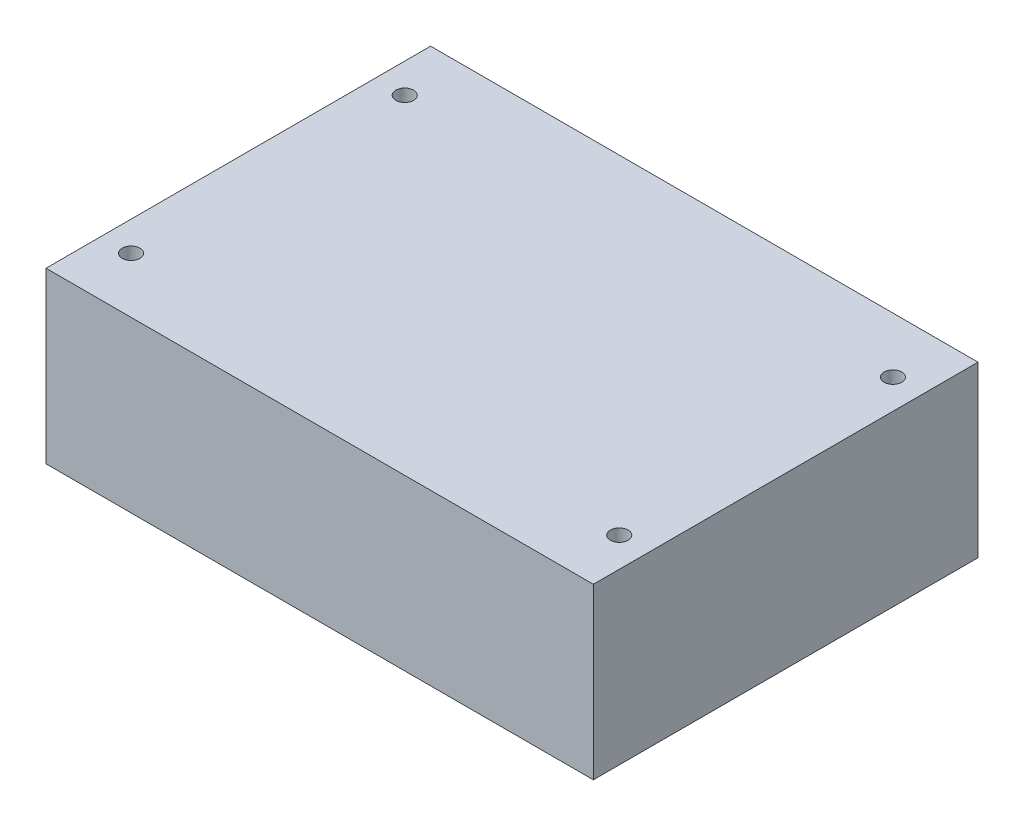
ISO-10303-21;
HEADER;
FILE_DESCRIPTION(('STEP AP214'),'2;1');
FILE_NAME('part.step','',(''),(''),'','','');
FILE_SCHEMA(('AUTOMOTIVE_DESIGN { 1 0 10303 214 1 1 1 1 }'));
ENDSEC;
DATA;
#1=APPLICATION_CONTEXT('core data for automotive mechanical design processes');
#2=APPLICATION_PROTOCOL_DEFINITION('international standard','automotive_design',2000,#1);
#3=PRODUCT_CONTEXT('',#1,'mechanical');
#4=PRODUCT('Part','Part','',(#3));
#5=PRODUCT_RELATED_PRODUCT_CATEGORY('part','',(#4));
#6=PRODUCT_DEFINITION_FORMATION('','',#4);
#7=PRODUCT_DEFINITION_CONTEXT('part definition',#1,'design');
#8=PRODUCT_DEFINITION('design','',#6,#7);
#9=PRODUCT_DEFINITION_SHAPE('','',#8);
#10=(LENGTH_UNIT() NAMED_UNIT(*) SI_UNIT(.MILLI.,.METRE.));
#11=(NAMED_UNIT(*) PLANE_ANGLE_UNIT() SI_UNIT($,.RADIAN.));
#12=(NAMED_UNIT(*) SI_UNIT($,.STERADIAN.) SOLID_ANGLE_UNIT());
#13=UNCERTAINTY_MEASURE_WITH_UNIT(LENGTH_MEASURE(1.E-05),#10,'distance_accuracy_value','');
#14=(GEOMETRIC_REPRESENTATION_CONTEXT(3) GLOBAL_UNCERTAINTY_ASSIGNED_CONTEXT((#13)) GLOBAL_UNIT_ASSIGNED_CONTEXT((#10,
#11,#12)) REPRESENTATION_CONTEXT('',''));
#15=CARTESIAN_POINT('',(0.,0.,0.));
#16=DIRECTION('',(0.,0.,1.));
#17=DIRECTION('',(1.,0.,0.));
#18=AXIS2_PLACEMENT_3D('',#15,#16,#17);
#19=CARTESIAN_POINT('',(0.,33.9,-52.));
#20=DIRECTION('',(0.,0.,-1.));
#21=DIRECTION('',(-1.,0.,0.));
#22=AXIS2_PLACEMENT_3D('',#19,#20,#21);
#23=PLANE('',#22);
#24=DIRECTION('',(1.,0.,0.));
#25=VECTOR('',#24,1.);
#26=CARTESIAN_POINT('',(0.,11.,-52.));
#27=LINE('',#26,#25);
#28=CARTESIAN_POINT('',(0.,11.,-52.));
#29=VERTEX_POINT('',#28);
#30=CARTESIAN_POINT('',(74.,11.,-52.));
#31=VERTEX_POINT('',#30);
#32=EDGE_CURVE('E123',#29,#31,#27,.T.);
#33=ORIENTED_EDGE('',*,*,#32,.F.);
#34=DIRECTION('',(0.,-1.,0.));
#35=VECTOR('',#34,1.);
#36=CARTESIAN_POINT('',(0.,33.9,-52.));
#37=LINE('',#36,#35);
#38=CARTESIAN_POINT('',(0.,33.9,-52.));
#39=VERTEX_POINT('',#38);
#40=EDGE_CURVE('E11',#39,#29,#37,.T.);
#41=ORIENTED_EDGE('',*,*,#40,.F.);
#42=DIRECTION('',(1.,0.,0.));
#43=VECTOR('',#42,1.);
#44=CARTESIAN_POINT('',(0.,33.9,-52.));
#45=LINE('',#44,#43);
#46=CARTESIAN_POINT('',(74.,33.9,-52.));
#47=VERTEX_POINT('',#46);
#48=EDGE_CURVE('E124',#39,#47,#45,.T.);
#49=ORIENTED_EDGE('',*,*,#48,.T.);
#50=DIRECTION('',(0.,-1.,0.));
#51=VECTOR('',#50,1.);
#52=CARTESIAN_POINT('',(74.,33.9,-52.));
#53=LINE('',#52,#51);
#54=EDGE_CURVE('E36',#47,#31,#53,.T.);
#55=ORIENTED_EDGE('',*,*,#54,.T.);
#56=EDGE_LOOP('',(#33,#41,#49,#55));
#57=FACE_BOUND('',#56,.T.);
#58=ADVANCED_FACE('F33',(#57),#23,.T.);
#59=CARTESIAN_POINT('',(0.,33.9,0.));
#60=DIRECTION('',(-1.,0.,0.));
#61=DIRECTION('',(0.,0.,1.));
#62=AXIS2_PLACEMENT_3D('',#59,#60,#61);
#63=PLANE('',#62);
#64=DIRECTION('',(0.,0.,-1.));
#65=VECTOR('',#64,1.);
#66=CARTESIAN_POINT('',(0.,11.,0.));
#67=LINE('',#66,#65);
#68=CARTESIAN_POINT('',(0.,11.,0.));
#69=VERTEX_POINT('',#68);
#70=EDGE_CURVE('E126',#69,#29,#67,.T.);
#71=ORIENTED_EDGE('',*,*,#70,.F.);
#72=DIRECTION('',(0.,-1.,0.));
#73=VECTOR('',#72,1.);
#74=CARTESIAN_POINT('',(0.,33.9,0.));
#75=LINE('',#74,#73);
#76=CARTESIAN_POINT('',(0.,33.9,0.));
#77=VERTEX_POINT('',#76);
#78=EDGE_CURVE('E42',#77,#69,#75,.T.);
#79=ORIENTED_EDGE('',*,*,#78,.F.);
#80=DIRECTION('',(0.,0.,-1.));
#81=VECTOR('',#80,1.);
#82=CARTESIAN_POINT('',(0.,33.9,0.));
#83=LINE('',#82,#81);
#84=EDGE_CURVE('E130',#77,#39,#83,.T.);
#85=ORIENTED_EDGE('',*,*,#84,.T.);
#86=ORIENTED_EDGE('',*,*,#40,.T.);
#87=EDGE_LOOP('',(#71,#79,#85,#86));
#88=FACE_BOUND('',#87,.T.);
#89=ADVANCED_FACE('F149',(#88),#63,.T.);
#90=CARTESIAN_POINT('',(0.,33.9,0.));
#91=DIRECTION('',(0.,0.,-1.));
#92=DIRECTION('',(-1.,0.,0.));
#93=AXIS2_PLACEMENT_3D('',#90,#91,#92);
#94=PLANE('',#93);
#95=DIRECTION('',(1.,0.,0.));
#96=VECTOR('',#95,1.);
#97=CARTESIAN_POINT('',(0.,11.,0.));
#98=LINE('',#97,#96);
#99=CARTESIAN_POINT('',(74.,11.,0.));
#100=VERTEX_POINT('',#99);
#101=EDGE_CURVE('E137',#69,#100,#98,.T.);
#102=ORIENTED_EDGE('',*,*,#101,.T.);
#103=DIRECTION('',(0.,-1.,0.));
#104=VECTOR('',#103,1.);
#105=CARTESIAN_POINT('',(74.,33.9,0.));
#106=LINE('',#105,#104);
#107=CARTESIAN_POINT('',(74.,33.9,0.));
#108=VERTEX_POINT('',#107);
#109=EDGE_CURVE('E141',#108,#100,#106,.T.);
#110=ORIENTED_EDGE('',*,*,#109,.F.);
#111=DIRECTION('',(1.,0.,0.));
#112=VECTOR('',#111,1.);
#113=CARTESIAN_POINT('',(0.,33.9,0.));
#114=LINE('',#113,#112);
#115=EDGE_CURVE('E128',#77,#108,#114,.T.);
#116=ORIENTED_EDGE('',*,*,#115,.F.);
#117=ORIENTED_EDGE('',*,*,#78,.T.);
#118=EDGE_LOOP('',(#102,#110,#116,#117));
#119=FACE_BOUND('',#118,.T.);
#120=ADVANCED_FACE('F151',(#119),#94,.F.);
#121=CARTESIAN_POINT('',(74.,33.9,0.));
#122=DIRECTION('',(-1.,0.,0.));
#123=DIRECTION('',(0.,0.,1.));
#124=AXIS2_PLACEMENT_3D('',#121,#122,#123);
#125=PLANE('',#124);
#126=DIRECTION('',(0.,0.,-1.));
#127=VECTOR('',#126,1.);
#128=CARTESIAN_POINT('',(74.,11.,0.));
#129=LINE('',#128,#127);
#130=EDGE_CURVE('E134',#100,#31,#129,.T.);
#131=ORIENTED_EDGE('',*,*,#130,.T.);
#132=ORIENTED_EDGE('',*,*,#54,.F.);
#133=DIRECTION('',(0.,0.,-1.));
#134=VECTOR('',#133,1.);
#135=CARTESIAN_POINT('',(74.,33.9,0.));
#136=LINE('',#135,#134);
#137=EDGE_CURVE('E76',#108,#47,#136,.T.);
#138=ORIENTED_EDGE('',*,*,#137,.F.);
#139=ORIENTED_EDGE('',*,*,#109,.T.);
#140=EDGE_LOOP('',(#131,#132,#138,#139));
#141=FACE_BOUND('',#140,.T.);
#142=ADVANCED_FACE('F146',(#141),#125,.F.);
#143=CARTESIAN_POINT('',(0.,33.9,0.));
#144=DIRECTION('',(0.,1.,0.));
#145=DIRECTION('',(0.,0.,1.));
#146=AXIS2_PLACEMENT_3D('',#143,#144,#145);
#147=PLANE('',#146);
#148=CARTESIAN_POINT('',(4.,33.9,-44.5));
#149=DIRECTION('',(0.,1.,0.));
#150=DIRECTION('',(0.,0.,1.));
#151=AXIS2_PLACEMENT_3D('',#148,#149,#150);
#152=CIRCLE('',#151,1.2);
#153=CARTESIAN_POINT('',(4.,33.9,-43.3));
#154=VERTEX_POINT('',#153);
#155=EDGE_CURVE('E101',#154,#154,#152,.T.);
#156=ORIENTED_EDGE('',*,*,#155,.F.);
#157=EDGE_LOOP('',(#156));
#158=FACE_BOUND('',#157,.T.);
#159=CARTESIAN_POINT('',(70.,33.9,-44.5));
#160=DIRECTION('',(0.,1.,0.));
#161=DIRECTION('',(0.,0.,1.));
#162=AXIS2_PLACEMENT_3D('',#159,#160,#161);
#163=CIRCLE('',#162,1.19999999999999);
#164=CARTESIAN_POINT('',(70.,33.9,-43.3));
#165=VERTEX_POINT('',#164);
#166=EDGE_CURVE('E100',#165,#165,#163,.T.);
#167=ORIENTED_EDGE('',*,*,#166,.F.);
#168=EDGE_LOOP('',(#167));
#169=FACE_BOUND('',#168,.T.);
#170=CARTESIAN_POINT('',(70.,33.9,-7.5));
#171=DIRECTION('',(0.,1.,0.));
#172=DIRECTION('',(0.,0.,1.));
#173=AXIS2_PLACEMENT_3D('',#170,#171,#172);
#174=CIRCLE('',#173,1.20000000000001);
#175=CARTESIAN_POINT('',(70.,33.9,-6.29999999999999));
#176=VERTEX_POINT('',#175);
#177=EDGE_CURVE('E111',#176,#176,#174,.T.);
#178=ORIENTED_EDGE('',*,*,#177,.F.);
#179=EDGE_LOOP('',(#178));
#180=FACE_BOUND('',#179,.T.);
#181=CARTESIAN_POINT('',(4.,33.9,-7.5));
#182=DIRECTION('',(0.,1.,0.));
#183=DIRECTION('',(0.,0.,1.));
#184=AXIS2_PLACEMENT_3D('',#181,#182,#183);
#185=CIRCLE('',#184,1.2);
#186=CARTESIAN_POINT('',(4.,33.9,-6.3));
#187=VERTEX_POINT('',#186);
#188=EDGE_CURVE('E117',#187,#187,#185,.T.);
#189=ORIENTED_EDGE('',*,*,#188,.F.);
#190=EDGE_LOOP('',(#189));
#191=FACE_BOUND('',#190,.T.);
#192=ORIENTED_EDGE('',*,*,#48,.F.);
#193=ORIENTED_EDGE('',*,*,#84,.F.);
#194=ORIENTED_EDGE('',*,*,#115,.T.);
#195=ORIENTED_EDGE('',*,*,#137,.T.);
#196=EDGE_LOOP('',(#192,#193,#194,#195));
#197=FACE_BOUND('',#196,.T.);
#198=ADVANCED_FACE('F152',(#158,#169,#180,#191,#197),#147,.T.);
#199=CARTESIAN_POINT('',(0.,11.,0.));
#200=DIRECTION('',(0.,1.,0.));
#201=DIRECTION('',(0.,0.,1.));
#202=AXIS2_PLACEMENT_3D('',#199,#200,#201);
#203=PLANE('',#202);
#204=ORIENTED_EDGE('',*,*,#32,.T.);
#205=ORIENTED_EDGE('',*,*,#130,.F.);
#206=ORIENTED_EDGE('',*,*,#101,.F.);
#207=ORIENTED_EDGE('',*,*,#70,.T.);
#208=EDGE_LOOP('',(#204,#205,#206,#207));
#209=FACE_BOUND('',#208,.T.);
#210=ADVANCED_FACE('F148',(#209),#203,.F.);
#211=CARTESIAN_POINT('',(4.,31.4,-7.5));
#212=DIRECTION('',(0.,1.,0.));
#213=DIRECTION('',(0.,0.,1.));
#214=AXIS2_PLACEMENT_3D('',#211,#212,#213);
#215=CONICAL_SURFACE('',#214,1.2,1.02974425867666);
#216=CARTESIAN_POINT('',(4.,30.6789672571669,-7.5));
#217=VERTEX_POINT('',#216);
#218=VERTEX_LOOP('',#217);
#219=FACE_BOUND('',#218,.T.);
#220=CARTESIAN_POINT('',(4.,31.4,-7.5));
#221=DIRECTION('',(0.,1.,0.));
#222=DIRECTION('',(0.,0.,1.));
#223=AXIS2_PLACEMENT_3D('',#220,#221,#222);
#224=CIRCLE('',#223,1.2);
#225=CARTESIAN_POINT('',(4.,31.4,-6.3));
#226=VERTEX_POINT('',#225);
#227=EDGE_CURVE('E120',#226,#226,#224,.T.);
#228=ORIENTED_EDGE('',*,*,#227,.T.);
#229=EDGE_LOOP('',(#228));
#230=FACE_BOUND('',#229,.T.);
#231=ADVANCED_FACE('F160',(#219,#230),#215,.F.);
#232=CARTESIAN_POINT('',(4.,33.9,-7.5));
#233=DIRECTION('',(0.,1.,0.));
#234=DIRECTION('',(0.,0.,1.));
#235=AXIS2_PLACEMENT_3D('',#232,#233,#234);
#236=CYLINDRICAL_SURFACE('',#235,1.2);
#237=ORIENTED_EDGE('',*,*,#227,.F.);
#238=EDGE_LOOP('',(#237));
#239=FACE_BOUND('',#238,.T.);
#240=ORIENTED_EDGE('',*,*,#188,.T.);
#241=EDGE_LOOP('',(#240));
#242=FACE_BOUND('',#241,.T.);
#243=ADVANCED_FACE('F199',(#239,#242),#236,.F.);
#244=CARTESIAN_POINT('',(70.,31.4,-7.5));
#245=DIRECTION('',(0.,1.,0.));
#246=DIRECTION('',(0.,0.,1.));
#247=AXIS2_PLACEMENT_3D('',#244,#245,#246);
#248=CONICAL_SURFACE('',#247,1.19999999999999,1.02974425867665);
#249=CARTESIAN_POINT('',(70.,30.6789672571669,-7.5));
#250=VERTEX_POINT('',#249);
#251=VERTEX_LOOP('',#250);
#252=FACE_BOUND('',#251,.T.);
#253=CARTESIAN_POINT('',(70.,31.4,-7.5));
#254=DIRECTION('',(0.,1.,0.));
#255=DIRECTION('',(0.,0.,1.));
#256=AXIS2_PLACEMENT_3D('',#253,#254,#255);
#257=CIRCLE('',#256,1.19999999999999);
#258=CARTESIAN_POINT('',(70.,31.4,-6.30000000000001));
#259=VERTEX_POINT('',#258);
#260=EDGE_CURVE('E114',#259,#259,#257,.T.);
#261=ORIENTED_EDGE('',*,*,#260,.T.);
#262=EDGE_LOOP('',(#261));
#263=FACE_BOUND('',#262,.T.);
#264=ADVANCED_FACE('F208',(#252,#263),#248,.F.);
#265=CARTESIAN_POINT('',(70.,33.9,-7.5));
#266=DIRECTION('',(0.,1.,0.));
#267=DIRECTION('',(0.,0.,1.));
#268=AXIS2_PLACEMENT_3D('',#265,#266,#267);
#269=CYLINDRICAL_SURFACE('',#268,1.2);
#270=ORIENTED_EDGE('',*,*,#260,.F.);
#271=EDGE_LOOP('',(#270));
#272=FACE_BOUND('',#271,.T.);
#273=ORIENTED_EDGE('',*,*,#177,.T.);
#274=EDGE_LOOP('',(#273));
#275=FACE_BOUND('',#274,.T.);
#276=ADVANCED_FACE('F218',(#272,#275),#269,.F.);
#277=CARTESIAN_POINT('',(70.,31.4,-44.5));
#278=DIRECTION('',(0.,1.,0.));
#279=DIRECTION('',(0.,0.,1.));
#280=AXIS2_PLACEMENT_3D('',#277,#278,#279);
#281=CONICAL_SURFACE('',#280,1.19999999999999,1.02974425867665);
#282=CARTESIAN_POINT('',(70.,30.6789672571669,-44.5));
#283=VERTEX_POINT('',#282);
#284=VERTEX_LOOP('',#283);
#285=FACE_BOUND('',#284,.T.);
#286=CARTESIAN_POINT('',(70.,31.4,-44.5));
#287=DIRECTION('',(0.,1.,0.));
#288=DIRECTION('',(0.,0.,1.));
#289=AXIS2_PLACEMENT_3D('',#286,#287,#288);
#290=CIRCLE('',#289,1.19999999999999);
#291=CARTESIAN_POINT('',(70.,31.4,-43.3));
#292=VERTEX_POINT('',#291);
#293=EDGE_CURVE('E104',#292,#292,#290,.T.);
#294=ORIENTED_EDGE('',*,*,#293,.T.);
#295=EDGE_LOOP('',(#294));
#296=FACE_BOUND('',#295,.T.);
#297=ADVANCED_FACE('F228',(#285,#296),#281,.F.);
#298=CARTESIAN_POINT('',(70.,33.9,-44.5));
#299=DIRECTION('',(0.,1.,0.));
#300=DIRECTION('',(0.,0.,1.));
#301=AXIS2_PLACEMENT_3D('',#298,#299,#300);
#302=CYLINDRICAL_SURFACE('',#301,1.19999999999999);
#303=ORIENTED_EDGE('',*,*,#293,.F.);
#304=EDGE_LOOP('',(#303));
#305=FACE_BOUND('',#304,.T.);
#306=ORIENTED_EDGE('',*,*,#166,.T.);
#307=EDGE_LOOP('',(#306));
#308=FACE_BOUND('',#307,.T.);
#309=ADVANCED_FACE('F94',(#305,#308),#302,.F.);
#310=CARTESIAN_POINT('',(4.,31.4,-44.5));
#311=DIRECTION('',(0.,1.,0.));
#312=DIRECTION('',(0.,0.,1.));
#313=AXIS2_PLACEMENT_3D('',#310,#311,#312);
#314=CONICAL_SURFACE('',#313,1.2,1.02974425867666);
#315=CARTESIAN_POINT('',(4.,30.6789672571669,-44.5));
#316=VERTEX_POINT('',#315);
#317=VERTEX_LOOP('',#316);
#318=FACE_BOUND('',#317,.T.);
#319=CARTESIAN_POINT('',(4.,31.4,-44.5));
#320=DIRECTION('',(0.,1.,0.));
#321=DIRECTION('',(0.,0.,1.));
#322=AXIS2_PLACEMENT_3D('',#319,#320,#321);
#323=CIRCLE('',#322,1.2);
#324=CARTESIAN_POINT('',(4.,31.4,-43.3));
#325=VERTEX_POINT('',#324);
#326=EDGE_CURVE('E98',#325,#325,#323,.T.);
#327=ORIENTED_EDGE('',*,*,#326,.T.);
#328=EDGE_LOOP('',(#327));
#329=FACE_BOUND('',#328,.T.);
#330=ADVANCED_FACE('F90',(#318,#329),#314,.F.);
#331=CARTESIAN_POINT('',(4.,33.9,-44.5));
#332=DIRECTION('',(0.,1.,0.));
#333=DIRECTION('',(0.,0.,1.));
#334=AXIS2_PLACEMENT_3D('',#331,#332,#333);
#335=CYLINDRICAL_SURFACE('',#334,1.2);
#336=ORIENTED_EDGE('',*,*,#326,.F.);
#337=EDGE_LOOP('',(#336));
#338=FACE_BOUND('',#337,.T.);
#339=ORIENTED_EDGE('',*,*,#155,.T.);
#340=EDGE_LOOP('',(#339));
#341=FACE_BOUND('',#340,.T.);
#342=ADVANCED_FACE('F93',(#338,#341),#335,.F.);
#343=CLOSED_SHELL('',(#58,#89,#120,#142,#198,#210,#231,#243,#264,#276,#297,#309,#330,#342));
#344=MANIFOLD_SOLID_BREP('B2',#343);
#345=ADVANCED_BREP_SHAPE_REPRESENTATION('',(#18,#344),#14);
#346=SHAPE_DEFINITION_REPRESENTATION(#9,#345);
ENDSEC;
END-ISO-10303-21;
